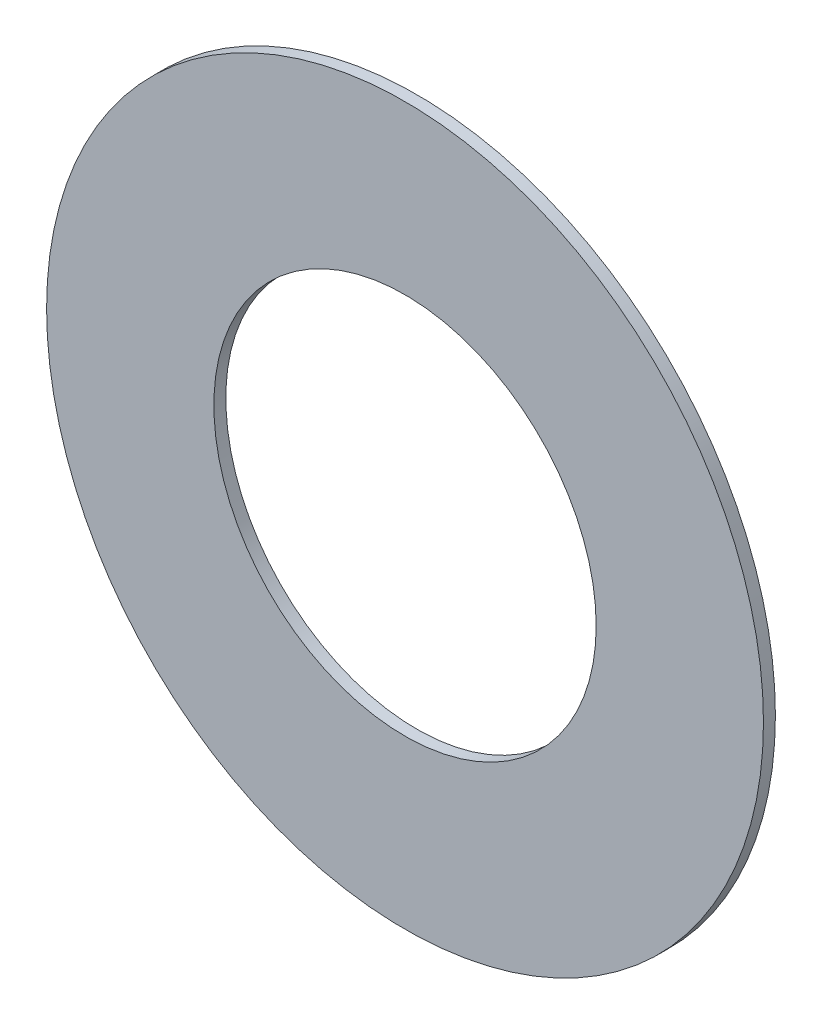
ISO-10303-21;
HEADER;
FILE_DESCRIPTION(('STEP AP214'),'2;1');
FILE_NAME('part.step','',(''),(''),'','','');
FILE_SCHEMA(('AUTOMOTIVE_DESIGN { 1 0 10303 214 1 1 1 1 }'));
ENDSEC;
DATA;
#1=APPLICATION_CONTEXT('core data for automotive mechanical design processes');
#2=APPLICATION_PROTOCOL_DEFINITION('international standard','automotive_design',2000,#1);
#3=PRODUCT_CONTEXT('',#1,'mechanical');
#4=PRODUCT('Part','Part','',(#3));
#5=PRODUCT_RELATED_PRODUCT_CATEGORY('part','',(#4));
#6=PRODUCT_DEFINITION_FORMATION('','',#4);
#7=PRODUCT_DEFINITION_CONTEXT('part definition',#1,'design');
#8=PRODUCT_DEFINITION('design','',#6,#7);
#9=PRODUCT_DEFINITION_SHAPE('','',#8);
#10=(LENGTH_UNIT() NAMED_UNIT(*) SI_UNIT(.MILLI.,.METRE.));
#11=(NAMED_UNIT(*) PLANE_ANGLE_UNIT() SI_UNIT($,.RADIAN.));
#12=(NAMED_UNIT(*) SI_UNIT($,.STERADIAN.) SOLID_ANGLE_UNIT());
#13=UNCERTAINTY_MEASURE_WITH_UNIT(LENGTH_MEASURE(1.E-05),#10,'distance_accuracy_value','');
#14=(GEOMETRIC_REPRESENTATION_CONTEXT(3) GLOBAL_UNCERTAINTY_ASSIGNED_CONTEXT((#13)) GLOBAL_UNIT_ASSIGNED_CONTEXT((#10,
#11,#12)) REPRESENTATION_CONTEXT('',''));
#15=CARTESIAN_POINT('',(0.,0.,0.));
#16=DIRECTION('',(0.,0.,1.));
#17=DIRECTION('',(1.,0.,0.));
#18=AXIS2_PLACEMENT_3D('',#15,#16,#17);
#19=CARTESIAN_POINT('',(-71.4447050168779,26.3180396673175,2.));
#20=DIRECTION('',(0.,0.,-1.));
#21=DIRECTION('',(-1.,0.,0.));
#22=AXIS2_PLACEMENT_3D('',#19,#20,#21);
#23=CYLINDRICAL_SURFACE('',#22,60.);
#24=CARTESIAN_POINT('',(-71.4447050168779,26.3180396673175,2.));
#25=DIRECTION('',(0.,0.,1.));
#26=DIRECTION('',(1.,0.,0.));
#27=AXIS2_PLACEMENT_3D('',#24,#25,#26);
#28=CIRCLE('',#27,60.);
#29=CARTESIAN_POINT('',(-11.4447050168779,26.3180396673175,2.));
#30=VERTEX_POINT('',#29);
#31=EDGE_CURVE('E10',#30,#30,#28,.T.);
#32=ORIENTED_EDGE('',*,*,#31,.F.);
#33=EDGE_LOOP('',(#32));
#34=FACE_BOUND('',#33,.T.);
#35=CARTESIAN_POINT('',(-71.4447050168779,26.3180396673175,0.));
#36=DIRECTION('',(0.,0.,1.));
#37=DIRECTION('',(1.,0.,0.));
#38=AXIS2_PLACEMENT_3D('',#35,#36,#37);
#39=CIRCLE('',#38,60.);
#40=CARTESIAN_POINT('',(-11.4447050168779,26.3180396673175,0.));
#41=VERTEX_POINT('',#40);
#42=EDGE_CURVE('E44',#41,#41,#39,.T.);
#43=ORIENTED_EDGE('',*,*,#42,.T.);
#44=EDGE_LOOP('',(#43));
#45=FACE_BOUND('',#44,.T.);
#46=ADVANCED_FACE('F41',(#34,#45),#23,.T.);
#47=CARTESIAN_POINT('',(-71.4447050168779,26.3180396673175,2.));
#48=DIRECTION('',(0.,0.,1.));
#49=DIRECTION('',(1.,0.,0.));
#50=AXIS2_PLACEMENT_3D('',#47,#48,#49);
#51=PLANE('',#50);
#52=CARTESIAN_POINT('',(-71.4447050168779,26.3180396673175,2.));
#53=DIRECTION('',(0.,0.,1.));
#54=DIRECTION('',(1.,0.,0.));
#55=AXIS2_PLACEMENT_3D('',#52,#53,#54);
#56=CIRCLE('',#55,32.);
#57=CARTESIAN_POINT('',(-39.4447050168779,26.3180396673175,2.));
#58=VERTEX_POINT('',#57);
#59=EDGE_CURVE('E51',#58,#58,#56,.T.);
#60=ORIENTED_EDGE('',*,*,#59,.F.);
#61=EDGE_LOOP('',(#60));
#62=FACE_BOUND('',#61,.T.);
#63=ORIENTED_EDGE('',*,*,#31,.T.);
#64=EDGE_LOOP('',(#63));
#65=FACE_BOUND('',#64,.T.);
#66=ADVANCED_FACE('F62',(#62,#65),#51,.T.);
#67=CARTESIAN_POINT('',(-71.4447050168779,26.3180396673175,0.));
#68=DIRECTION('',(0.,0.,1.));
#69=DIRECTION('',(1.,0.,0.));
#70=AXIS2_PLACEMENT_3D('',#67,#68,#69);
#71=PLANE('',#70);
#72=CARTESIAN_POINT('',(-71.4447050168779,26.3180396673175,0.));
#73=DIRECTION('',(0.,0.,1.));
#74=DIRECTION('',(1.,0.,0.));
#75=AXIS2_PLACEMENT_3D('',#72,#73,#74);
#76=CIRCLE('',#75,32.);
#77=CARTESIAN_POINT('',(-39.4447050168779,26.3180396673175,0.));
#78=VERTEX_POINT('',#77);
#79=EDGE_CURVE('E53',#78,#78,#76,.T.);
#80=ORIENTED_EDGE('',*,*,#79,.T.);
#81=EDGE_LOOP('',(#80));
#82=FACE_BOUND('',#81,.T.);
#83=ORIENTED_EDGE('',*,*,#42,.F.);
#84=EDGE_LOOP('',(#83));
#85=FACE_BOUND('',#84,.T.);
#86=ADVANCED_FACE('F64',(#82,#85),#71,.F.);
#87=CARTESIAN_POINT('',(-71.4447050168779,26.3180396673175,2.));
#88=DIRECTION('',(0.,0.,-1.));
#89=DIRECTION('',(-1.,0.,0.));
#90=AXIS2_PLACEMENT_3D('',#87,#88,#89);
#91=CYLINDRICAL_SURFACE('',#90,32.);
#92=ORIENTED_EDGE('',*,*,#59,.T.);
#93=EDGE_LOOP('',(#92));
#94=FACE_BOUND('',#93,.T.);
#95=ORIENTED_EDGE('',*,*,#79,.F.);
#96=EDGE_LOOP('',(#95));
#97=FACE_BOUND('',#96,.T.);
#98=ADVANCED_FACE('F59',(#94,#97),#91,.F.);
#99=CLOSED_SHELL('',(#46,#66,#86,#98));
#100=MANIFOLD_SOLID_BREP('B2',#99);
#101=ADVANCED_BREP_SHAPE_REPRESENTATION('',(#18,#100),#14);
#102=SHAPE_DEFINITION_REPRESENTATION(#9,#101);
ENDSEC;
END-ISO-10303-21;
